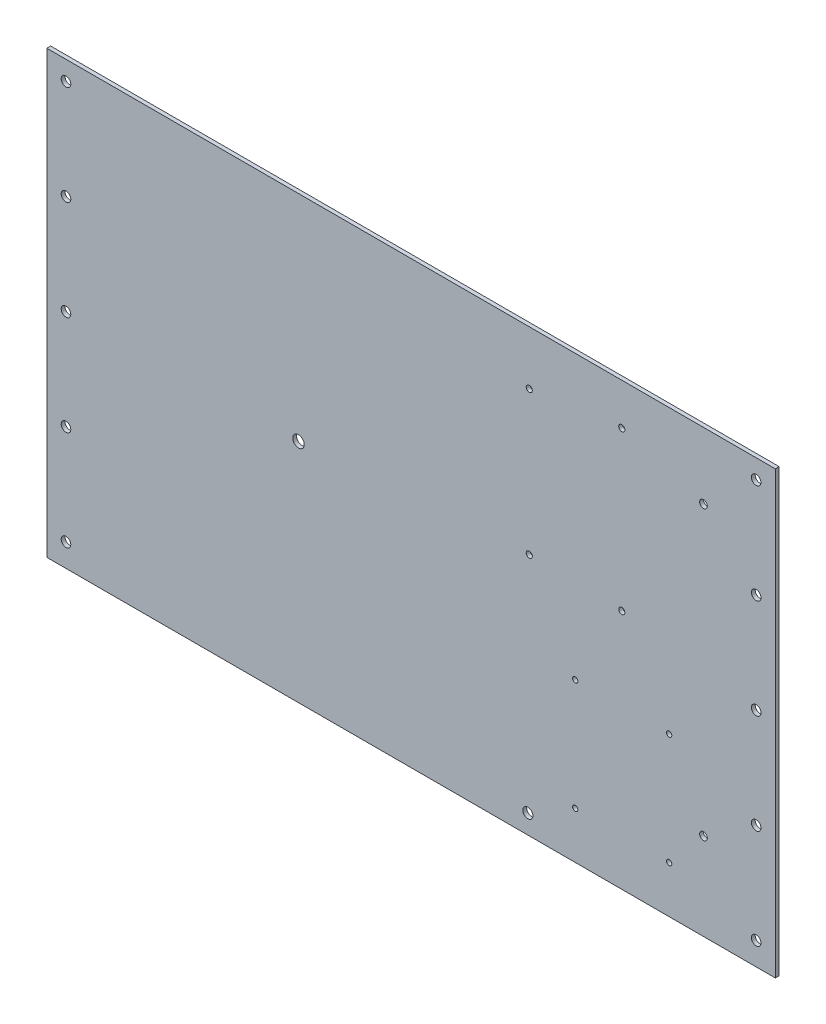
ISO-10303-21;
HEADER;
FILE_DESCRIPTION(('STEP AP214'),'2;1');
FILE_NAME('part.step','',(''),(''),'','','');
FILE_SCHEMA(('AUTOMOTIVE_DESIGN { 1 0 10303 214 1 1 1 1 }'));
ENDSEC;
DATA;
#1=APPLICATION_CONTEXT('core data for automotive mechanical design processes');
#2=APPLICATION_PROTOCOL_DEFINITION('international standard','automotive_design',2000,#1);
#3=PRODUCT_CONTEXT('',#1,'mechanical');
#4=PRODUCT('Part','Part','',(#3));
#5=PRODUCT_RELATED_PRODUCT_CATEGORY('part','',(#4));
#6=PRODUCT_DEFINITION_FORMATION('','',#4);
#7=PRODUCT_DEFINITION_CONTEXT('part definition',#1,'design');
#8=PRODUCT_DEFINITION('design','',#6,#7);
#9=PRODUCT_DEFINITION_SHAPE('','',#8);
#10=(LENGTH_UNIT() NAMED_UNIT(*) SI_UNIT(.MILLI.,.METRE.));
#11=(NAMED_UNIT(*) PLANE_ANGLE_UNIT() SI_UNIT($,.RADIAN.));
#12=(NAMED_UNIT(*) SI_UNIT($,.STERADIAN.) SOLID_ANGLE_UNIT());
#13=UNCERTAINTY_MEASURE_WITH_UNIT(LENGTH_MEASURE(1.E-05),#10,'distance_accuracy_value','');
#14=(GEOMETRIC_REPRESENTATION_CONTEXT(3) GLOBAL_UNCERTAINTY_ASSIGNED_CONTEXT((#13)) GLOBAL_UNIT_ASSIGNED_CONTEXT((#10,
#11,#12)) REPRESENTATION_CONTEXT('',''));
#15=CARTESIAN_POINT('',(0.,0.,0.));
#16=DIRECTION('',(0.,0.,1.));
#17=DIRECTION('',(1.,0.,0.));
#18=AXIS2_PLACEMENT_3D('',#15,#16,#17);
#19=CARTESIAN_POINT('',(-4.52428779759877,-79.9999999999998,2.));
#20=DIRECTION('',(-1.,0.,0.));
#21=DIRECTION('',(0.,-1.,0.));
#22=AXIS2_PLACEMENT_3D('',#19,#20,#21);
#23=PLANE('',#22);
#24=DIRECTION('',(0.,1.,0.));
#25=VECTOR('',#24,1.);
#26=CARTESIAN_POINT('',(-4.52428779759877,-79.9999999999998,0.));
#27=LINE('',#26,#25);
#28=CARTESIAN_POINT('',(-4.52428779759875,-310.,0.));
#29=VERTEX_POINT('',#28);
#30=CARTESIAN_POINT('',(-4.52428779759877,-79.9999999999998,0.));
#31=VERTEX_POINT('',#30);
#32=EDGE_CURVE('E96',#29,#31,#27,.T.);
#33=ORIENTED_EDGE('',*,*,#32,.T.);
#34=DIRECTION('',(0.,0.,-1.));
#35=VECTOR('',#34,1.);
#36=CARTESIAN_POINT('',(-4.52428779759877,-79.9999999999998,2.));
#37=LINE('',#36,#35);
#38=CARTESIAN_POINT('',(-4.52428779759877,-79.9999999999998,2.));
#39=VERTEX_POINT('',#38);
#40=EDGE_CURVE('E11',#39,#31,#37,.T.);
#41=ORIENTED_EDGE('',*,*,#40,.F.);
#42=DIRECTION('',(0.,1.,0.));
#43=VECTOR('',#42,1.);
#44=CARTESIAN_POINT('',(-4.52428779759877,-79.9999999999998,2.));
#45=LINE('',#44,#43);
#46=CARTESIAN_POINT('',(-4.52428779759875,-310.,2.));
#47=VERTEX_POINT('',#46);
#48=EDGE_CURVE('E84',#47,#39,#45,.T.);
#49=ORIENTED_EDGE('',*,*,#48,.F.);
#50=DIRECTION('',(0.,0.,-1.));
#51=VECTOR('',#50,1.);
#52=CARTESIAN_POINT('',(-4.52428779759875,-310.,2.));
#53=LINE('',#52,#51);
#54=EDGE_CURVE('E92',#47,#29,#53,.T.);
#55=ORIENTED_EDGE('',*,*,#54,.T.);
#56=EDGE_LOOP('',(#33,#41,#49,#55));
#57=FACE_BOUND('',#56,.T.);
#58=ADVANCED_FACE('F33',(#57),#23,.F.);
#59=CARTESIAN_POINT('',(-4.52428779759877,-79.9999999999998,2.));
#60=DIRECTION('',(0.,-1.,0.));
#61=DIRECTION('',(1.,0.,0.));
#62=AXIS2_PLACEMENT_3D('',#59,#60,#61);
#63=PLANE('',#62);
#64=DIRECTION('',(-1.,0.,0.));
#65=VECTOR('',#64,1.);
#66=CARTESIAN_POINT('',(-4.52428779759877,-79.9999999999998,0.));
#67=LINE('',#66,#65);
#68=CARTESIAN_POINT('',(-384.524287797599,-79.9999999999999,0.));
#69=VERTEX_POINT('',#68);
#70=EDGE_CURVE('E88',#31,#69,#67,.T.);
#71=ORIENTED_EDGE('',*,*,#70,.T.);
#72=DIRECTION('',(0.,0.,-1.));
#73=VECTOR('',#72,1.);
#74=CARTESIAN_POINT('',(-384.524287797599,-79.9999999999999,2.));
#75=LINE('',#74,#73);
#76=CARTESIAN_POINT('',(-384.524287797599,-79.9999999999999,2.));
#77=VERTEX_POINT('',#76);
#78=EDGE_CURVE('E41',#77,#69,#75,.T.);
#79=ORIENTED_EDGE('',*,*,#78,.F.);
#80=DIRECTION('',(-1.,0.,0.));
#81=VECTOR('',#80,1.);
#82=CARTESIAN_POINT('',(-4.52428779759877,-79.9999999999998,2.));
#83=LINE('',#82,#81);
#84=EDGE_CURVE('E79',#39,#77,#83,.T.);
#85=ORIENTED_EDGE('',*,*,#84,.F.);
#86=ORIENTED_EDGE('',*,*,#40,.T.);
#87=EDGE_LOOP('',(#71,#79,#85,#86));
#88=FACE_BOUND('',#87,.T.);
#89=ADVANCED_FACE('F87',(#88),#63,.F.);
#90=CARTESIAN_POINT('',(-384.524287797599,-79.9999999999999,2.));
#91=DIRECTION('',(1.,0.,0.));
#92=DIRECTION('',(0.,0.,-1.));
#93=AXIS2_PLACEMENT_3D('',#90,#91,#92);
#94=PLANE('',#93);
#95=DIRECTION('',(0.,-1.,0.));
#96=VECTOR('',#95,1.);
#97=CARTESIAN_POINT('',(-384.524287797599,-79.9999999999999,0.));
#98=LINE('',#97,#96);
#99=CARTESIAN_POINT('',(-384.524287797599,-310.,0.));
#100=VERTEX_POINT('',#99);
#101=EDGE_CURVE('E66',#69,#100,#98,.T.);
#102=ORIENTED_EDGE('',*,*,#101,.T.);
#103=DIRECTION('',(0.,0.,-1.));
#104=VECTOR('',#103,1.);
#105=CARTESIAN_POINT('',(-384.524287797599,-310.,2.));
#106=LINE('',#105,#104);
#107=CARTESIAN_POINT('',(-384.524287797599,-310.,2.));
#108=VERTEX_POINT('',#107);
#109=EDGE_CURVE('E89',#108,#100,#106,.T.);
#110=ORIENTED_EDGE('',*,*,#109,.F.);
#111=DIRECTION('',(0.,-1.,0.));
#112=VECTOR('',#111,1.);
#113=CARTESIAN_POINT('',(-384.524287797599,-79.9999999999999,2.));
#114=LINE('',#113,#112);
#115=EDGE_CURVE('E82',#77,#108,#114,.T.);
#116=ORIENTED_EDGE('',*,*,#115,.F.);
#117=ORIENTED_EDGE('',*,*,#78,.T.);
#118=EDGE_LOOP('',(#102,#110,#116,#117));
#119=FACE_BOUND('',#118,.T.);
#120=ADVANCED_FACE('F90',(#119),#94,.F.);
#121=CARTESIAN_POINT('',(-4.52428779759875,-310.,2.));
#122=DIRECTION('',(0.,1.,0.));
#123=DIRECTION('',(-1.,0.,0.));
#124=AXIS2_PLACEMENT_3D('',#121,#122,#123);
#125=PLANE('',#124);
#126=DIRECTION('',(1.,0.,0.));
#127=VECTOR('',#126,1.);
#128=CARTESIAN_POINT('',(-4.52428779759875,-310.,0.));
#129=LINE('',#128,#127);
#130=EDGE_CURVE('E72',#100,#29,#129,.T.);
#131=ORIENTED_EDGE('',*,*,#130,.T.);
#132=ORIENTED_EDGE('',*,*,#54,.F.);
#133=DIRECTION('',(1.,0.,0.));
#134=VECTOR('',#133,1.);
#135=CARTESIAN_POINT('',(-4.52428779759875,-310.,2.));
#136=LINE('',#135,#134);
#137=EDGE_CURVE('E49',#108,#47,#136,.T.);
#138=ORIENTED_EDGE('',*,*,#137,.F.);
#139=ORIENTED_EDGE('',*,*,#109,.T.);
#140=EDGE_LOOP('',(#131,#132,#138,#139));
#141=FACE_BOUND('',#140,.T.);
#142=ADVANCED_FACE('F104',(#141),#125,.F.);
#143=CARTESIAN_POINT('',(0.,0.,2.));
#144=DIRECTION('',(0.,0.,-1.));
#145=DIRECTION('',(-1.,0.,0.));
#146=AXIS2_PLACEMENT_3D('',#143,#144,#145);
#147=PLANE('',#146);
#148=CARTESIAN_POINT('',(-133.614229540646,-300.,2.));
#149=DIRECTION('',(0.,0.,1.));
#150=DIRECTION('',(1.,0.,0.));
#151=AXIS2_PLACEMENT_3D('',#148,#149,#150);
#152=CIRCLE('',#151,2.59999999999999);
#153=CARTESIAN_POINT('',(-131.014229540646,-300.,2.));
#154=VERTEX_POINT('',#153);
#155=EDGE_CURVE('E236',#154,#154,#152,.T.);
#156=ORIENTED_EDGE('',*,*,#155,.F.);
#157=EDGE_LOOP('',(#156));
#158=FACE_BOUND('',#157,.T.);
#159=CARTESIAN_POINT('',(-84.6190740075595,-101.667480714402,2.));
#160=DIRECTION('',(0.,0.,1.));
#161=DIRECTION('',(1.,0.,0.));
#162=AXIS2_PLACEMENT_3D('',#159,#160,#161);
#163=CIRCLE('',#162,1.60476866508562);
#164=CARTESIAN_POINT('',(-83.0143053424738,-101.667480714402,2.));
#165=VERTEX_POINT('',#164);
#166=EDGE_CURVE('E195',#165,#165,#163,.T.);
#167=ORIENTED_EDGE('',*,*,#166,.F.);
#168=EDGE_LOOP('',(#167));
#169=FACE_BOUND('',#168,.T.);
#170=CARTESIAN_POINT('',(-253.250828503278,-191.950902838941,2.));
#171=DIRECTION('',(0.,0.,1.));
#172=DIRECTION('',(1.,0.,0.));
#173=AXIS2_PLACEMENT_3D('',#170,#171,#172);
#174=CIRCLE('',#173,2.99999999999999);
#175=CARTESIAN_POINT('',(-250.250828503278,-191.950902838941,2.));
#176=VERTEX_POINT('',#175);
#177=EDGE_CURVE('E220',#176,#176,#174,.T.);
#178=ORIENTED_EDGE('',*,*,#177,.F.);
#179=EDGE_LOOP('',(#178));
#180=FACE_BOUND('',#179,.T.);
#181=CARTESIAN_POINT('',(-42.0242877975989,-114.637326757356,2.));
#182=DIRECTION('',(0.,0.,1.));
#183=DIRECTION('',(1.,0.,0.));
#184=AXIS2_PLACEMENT_3D('',#181,#182,#183);
#185=CIRCLE('',#184,1.99507445987253);
#186=CARTESIAN_POINT('',(-40.0292133377264,-114.637326757356,2.));
#187=VERTEX_POINT('',#186);
#188=EDGE_CURVE('E227',#187,#187,#185,.T.);
#189=ORIENTED_EDGE('',*,*,#188,.F.);
#190=EDGE_LOOP('',(#189));
#191=FACE_BOUND('',#190,.T.);
#192=CARTESIAN_POINT('',(-132.879074007559,-108.017480714402,2.));
#193=DIRECTION('',(0.,0.,1.));
#194=DIRECTION('',(1.,0.,0.));
#195=AXIS2_PLACEMENT_3D('',#192,#193,#194);
#196=CIRCLE('',#195,1.58968929716832);
#197=CARTESIAN_POINT('',(-131.289384710391,-108.017480714402,2.));
#198=VERTEX_POINT('',#197);
#199=EDGE_CURVE('E189',#198,#198,#196,.T.);
#200=ORIENTED_EDGE('',*,*,#199,.F.);
#201=EDGE_LOOP('',(#200));
#202=FACE_BOUND('',#201,.T.);
#203=CARTESIAN_POINT('',(-132.879074007559,-182.947480714402,2.));
#204=DIRECTION('',(0.,0.,1.));
#205=DIRECTION('',(1.,0.,0.));
#206=AXIS2_PLACEMENT_3D('',#203,#204,#205);
#207=CIRCLE('',#206,1.58749999999992);
#208=CARTESIAN_POINT('',(-131.291574007559,-182.947480714402,2.));
#209=VERTEX_POINT('',#208);
#210=EDGE_CURVE('E183',#209,#209,#207,.T.);
#211=ORIENTED_EDGE('',*,*,#210,.F.);
#212=EDGE_LOOP('',(#211));
#213=FACE_BOUND('',#212,.T.);
#214=CARTESIAN_POINT('',(-84.6190740075595,-184.217480714402,2.));
#215=DIRECTION('',(0.,0.,1.));
#216=DIRECTION('',(1.,0.,0.));
#217=AXIS2_PLACEMENT_3D('',#214,#215,#216);
#218=CIRCLE('',#217,1.58749999999996);
#219=CARTESIAN_POINT('',(-83.0315740075595,-184.217480714402,2.));
#220=VERTEX_POINT('',#219);
#221=EDGE_CURVE('E177',#220,#220,#218,.T.);
#222=ORIENTED_EDGE('',*,*,#221,.F.);
#223=EDGE_LOOP('',(#222));
#224=FACE_BOUND('',#223,.T.);
#225=CARTESIAN_POINT('',(-108.908932218328,-227.518390056277,2.));
#226=DIRECTION('',(0.,0.,1.));
#227=DIRECTION('',(1.,0.,0.));
#228=AXIS2_PLACEMENT_3D('',#225,#226,#227);
#229=CIRCLE('',#228,1.37500000000002);
#230=CARTESIAN_POINT('',(-107.533932218328,-227.518390056277,2.));
#231=VERTEX_POINT('',#230);
#232=EDGE_CURVE('E170',#231,#231,#229,.T.);
#233=ORIENTED_EDGE('',*,*,#232,.F.);
#234=EDGE_LOOP('',(#233));
#235=FACE_BOUND('',#234,.T.);
#236=CARTESIAN_POINT('',(-42.0242877975989,-264.637326757356,2.));
#237=DIRECTION('',(0.,0.,1.));
#238=DIRECTION('',(1.,0.,0.));
#239=AXIS2_PLACEMENT_3D('',#236,#237,#238);
#240=CIRCLE('',#239,2.00000000000002);
#241=CARTESIAN_POINT('',(-40.0242877975989,-264.637326757356,2.));
#242=VERTEX_POINT('',#241);
#243=EDGE_CURVE('E208',#242,#242,#240,.T.);
#244=ORIENTED_EDGE('',*,*,#243,.F.);
#245=EDGE_LOOP('',(#244));
#246=FACE_BOUND('',#245,.T.);
#247=CARTESIAN_POINT('',(-108.908932218328,-285.518390056277,2.));
#248=DIRECTION('',(0.,0.,1.));
#249=DIRECTION('',(1.,0.,0.));
#250=AXIS2_PLACEMENT_3D('',#247,#248,#249);
#251=CIRCLE('',#250,1.36223874659975);
#252=CARTESIAN_POINT('',(-107.546693471728,-285.518390056277,2.));
#253=VERTEX_POINT('',#252);
#254=EDGE_CURVE('E215',#253,#253,#251,.T.);
#255=ORIENTED_EDGE('',*,*,#254,.F.);
#256=EDGE_LOOP('',(#255));
#257=FACE_BOUND('',#256,.T.);
#258=CARTESIAN_POINT('',(-59.9089322183282,-285.518390056277,2.));
#259=DIRECTION('',(0.,0.,1.));
#260=DIRECTION('',(1.,0.,0.));
#261=AXIS2_PLACEMENT_3D('',#258,#259,#260);
#262=CIRCLE('',#261,1.37250157420993);
#263=CARTESIAN_POINT('',(-58.5364306441182,-285.518390056277,2.));
#264=VERTEX_POINT('',#263);
#265=EDGE_CURVE('E196',#264,#264,#262,.T.);
#266=ORIENTED_EDGE('',*,*,#265,.F.);
#267=EDGE_LOOP('',(#266));
#268=FACE_BOUND('',#267,.T.);
#269=CARTESIAN_POINT('',(-59.9089322183282,-227.518390056277,2.));
#270=DIRECTION('',(0.,0.,1.));
#271=DIRECTION('',(1.,0.,0.));
#272=AXIS2_PLACEMENT_3D('',#269,#270,#271);
#273=CIRCLE('',#272,1.37500000000001);
#274=CARTESIAN_POINT('',(-58.5339322183282,-227.518390056277,2.));
#275=VERTEX_POINT('',#274);
#276=EDGE_CURVE('E203',#275,#275,#273,.T.);
#277=ORIENTED_EDGE('',*,*,#276,.F.);
#278=EDGE_LOOP('',(#277));
#279=FACE_BOUND('',#278,.T.);
#280=CARTESIAN_POINT('',(-14.524287797599,-89.9999999999998,2.));
#281=DIRECTION('',(0.,0.,1.));
#282=DIRECTION('',(1.,0.,0.));
#283=AXIS2_PLACEMENT_3D('',#280,#281,#282);
#284=CIRCLE('',#283,2.50000000000002);
#285=CARTESIAN_POINT('',(-12.024287797599,-89.9999999999998,2.));
#286=VERTEX_POINT('',#285);
#287=EDGE_CURVE('E119',#286,#286,#284,.T.);
#288=ORIENTED_EDGE('',*,*,#287,.F.);
#289=EDGE_LOOP('',(#288));
#290=FACE_BOUND('',#289,.T.);
#291=CARTESIAN_POINT('',(-14.5242877975985,-142.,2.));
#292=DIRECTION('',(0.,0.,1.));
#293=DIRECTION('',(1.,0.,0.));
#294=AXIS2_PLACEMENT_3D('',#291,#292,#293);
#295=CIRCLE('',#294,2.50000000000002);
#296=CARTESIAN_POINT('',(-12.0242877975984,-142.,2.));
#297=VERTEX_POINT('',#296);
#298=EDGE_CURVE('E126',#297,#297,#295,.T.);
#299=ORIENTED_EDGE('',*,*,#298,.F.);
#300=EDGE_LOOP('',(#299));
#301=FACE_BOUND('',#300,.T.);
#302=CARTESIAN_POINT('',(-14.5242877975979,-194.,2.));
#303=DIRECTION('',(0.,0.,1.));
#304=DIRECTION('',(1.,0.,0.));
#305=AXIS2_PLACEMENT_3D('',#302,#303,#304);
#306=CIRCLE('',#305,2.50000000000002);
#307=CARTESIAN_POINT('',(-12.0242877975979,-194.,2.));
#308=VERTEX_POINT('',#307);
#309=EDGE_CURVE('E132',#308,#308,#306,.T.);
#310=ORIENTED_EDGE('',*,*,#309,.F.);
#311=EDGE_LOOP('',(#310));
#312=FACE_BOUND('',#311,.T.);
#313=CARTESIAN_POINT('',(-14.5242877975968,-298.,2.));
#314=DIRECTION('',(0.,0.,1.));
#315=DIRECTION('',(1.,0.,0.));
#316=AXIS2_PLACEMENT_3D('',#313,#314,#315);
#317=CIRCLE('',#316,2.50000000000002);
#318=CARTESIAN_POINT('',(-12.0242877975968,-298.,2.));
#319=VERTEX_POINT('',#318);
#320=EDGE_CURVE('E138',#319,#319,#317,.T.);
#321=ORIENTED_EDGE('',*,*,#320,.F.);
#322=EDGE_LOOP('',(#321));
#323=FACE_BOUND('',#322,.T.);
#324=CARTESIAN_POINT('',(-14.5242877975974,-246.,2.));
#325=DIRECTION('',(0.,0.,1.));
#326=DIRECTION('',(1.,0.,0.));
#327=AXIS2_PLACEMENT_3D('',#324,#325,#326);
#328=CIRCLE('',#327,2.50000000000002);
#329=CARTESIAN_POINT('',(-12.0242877975974,-246.,2.));
#330=VERTEX_POINT('',#329);
#331=EDGE_CURVE('E144',#330,#330,#328,.T.);
#332=ORIENTED_EDGE('',*,*,#331,.F.);
#333=EDGE_LOOP('',(#332));
#334=FACE_BOUND('',#333,.T.);
#335=CARTESIAN_POINT('',(-374.524287797597,-298.,2.));
#336=DIRECTION('',(0.,0.,1.));
#337=DIRECTION('',(1.,0.,0.));
#338=AXIS2_PLACEMENT_3D('',#335,#336,#337);
#339=CIRCLE('',#338,2.50000000000002);
#340=CARTESIAN_POINT('',(-372.024287797597,-298.,2.));
#341=VERTEX_POINT('',#340);
#342=EDGE_CURVE('E150',#341,#341,#339,.T.);
#343=ORIENTED_EDGE('',*,*,#342,.F.);
#344=EDGE_LOOP('',(#343));
#345=FACE_BOUND('',#344,.T.);
#346=CARTESIAN_POINT('',(-374.524287797597,-246.,2.));
#347=DIRECTION('',(0.,0.,1.));
#348=DIRECTION('',(1.,0.,0.));
#349=AXIS2_PLACEMENT_3D('',#346,#347,#348);
#350=CIRCLE('',#349,2.50000000000002);
#351=CARTESIAN_POINT('',(-372.024287797597,-246.,2.));
#352=VERTEX_POINT('',#351);
#353=EDGE_CURVE('E156',#352,#352,#350,.T.);
#354=ORIENTED_EDGE('',*,*,#353,.F.);
#355=EDGE_LOOP('',(#354));
#356=FACE_BOUND('',#355,.T.);
#357=CARTESIAN_POINT('',(-374.524287797598,-194.,2.));
#358=DIRECTION('',(0.,0.,1.));
#359=DIRECTION('',(1.,0.,0.));
#360=AXIS2_PLACEMENT_3D('',#357,#358,#359);
#361=CIRCLE('',#360,2.50000000000002);
#362=CARTESIAN_POINT('',(-372.024287797598,-194.,2.));
#363=VERTEX_POINT('',#362);
#364=EDGE_CURVE('E162',#363,#363,#361,.T.);
#365=ORIENTED_EDGE('',*,*,#364,.F.);
#366=EDGE_LOOP('',(#365));
#367=FACE_BOUND('',#366,.T.);
#368=CARTESIAN_POINT('',(-374.524287797598,-142.,2.));
#369=DIRECTION('',(0.,0.,1.));
#370=DIRECTION('',(1.,0.,0.));
#371=AXIS2_PLACEMENT_3D('',#368,#369,#370);
#372=CIRCLE('',#371,2.50000000000002);
#373=CARTESIAN_POINT('',(-372.024287797598,-142.,2.));
#374=VERTEX_POINT('',#373);
#375=EDGE_CURVE('E113',#374,#374,#372,.T.);
#376=ORIENTED_EDGE('',*,*,#375,.F.);
#377=EDGE_LOOP('',(#376));
#378=FACE_BOUND('',#377,.T.);
#379=CARTESIAN_POINT('',(-374.524287797599,-89.9999999999998,2.));
#380=DIRECTION('',(0.,0.,1.));
#381=DIRECTION('',(1.,0.,0.));
#382=AXIS2_PLACEMENT_3D('',#379,#380,#381);
#383=CIRCLE('',#382,2.50000000000002);
#384=CARTESIAN_POINT('',(-372.024287797599,-89.9999999999998,2.));
#385=VERTEX_POINT('',#384);
#386=EDGE_CURVE('E110',#385,#385,#383,.T.);
#387=ORIENTED_EDGE('',*,*,#386,.F.);
#388=EDGE_LOOP('',(#387));
#389=FACE_BOUND('',#388,.T.);
#390=ORIENTED_EDGE('',*,*,#48,.T.);
#391=ORIENTED_EDGE('',*,*,#84,.T.);
#392=ORIENTED_EDGE('',*,*,#115,.T.);
#393=ORIENTED_EDGE('',*,*,#137,.T.);
#394=EDGE_LOOP('',(#390,#391,#392,#393));
#395=FACE_BOUND('',#394,.T.);
#396=ADVANCED_FACE('F80',(#158,#169,#180,#191,#202,#213,#224,#235,#246,#257,#268,#279,#290,#301,
#312,#323,#334,#345,#356,#367,#378,#389,#395),#147,.F.);
#397=CARTESIAN_POINT('',(0.,0.,0.));
#398=DIRECTION('',(0.,0.,-1.));
#399=DIRECTION('',(-1.,0.,0.));
#400=AXIS2_PLACEMENT_3D('',#397,#398,#399);
#401=PLANE('',#400);
#402=CARTESIAN_POINT('',(-133.614229540646,-300.,0.));
#403=DIRECTION('',(0.,0.,1.));
#404=DIRECTION('',(1.,0.,0.));
#405=AXIS2_PLACEMENT_3D('',#402,#403,#404);
#406=CIRCLE('',#405,2.59999999999999);
#407=CARTESIAN_POINT('',(-131.014229540646,-300.,0.));
#408=VERTEX_POINT('',#407);
#409=EDGE_CURVE('E224',#408,#408,#406,.T.);
#410=ORIENTED_EDGE('',*,*,#409,.T.);
#411=EDGE_LOOP('',(#410));
#412=FACE_BOUND('',#411,.T.);
#413=CARTESIAN_POINT('',(-84.6190740075595,-101.667480714402,0.));
#414=DIRECTION('',(0.,0.,1.));
#415=DIRECTION('',(1.,0.,0.));
#416=AXIS2_PLACEMENT_3D('',#413,#414,#415);
#417=CIRCLE('',#416,1.60476866508562);
#418=CARTESIAN_POINT('',(-83.0143053424738,-101.667480714402,0.));
#419=VERTEX_POINT('',#418);
#420=EDGE_CURVE('E120',#419,#419,#417,.T.);
#421=ORIENTED_EDGE('',*,*,#420,.T.);
#422=EDGE_LOOP('',(#421));
#423=FACE_BOUND('',#422,.T.);
#424=CARTESIAN_POINT('',(-253.250828503278,-191.950902838941,0.));
#425=DIRECTION('',(0.,0.,1.));
#426=DIRECTION('',(1.,0.,0.));
#427=AXIS2_PLACEMENT_3D('',#424,#425,#426);
#428=CIRCLE('',#427,2.99999999999999);
#429=CARTESIAN_POINT('',(-250.250828503278,-191.950902838941,0.));
#430=VERTEX_POINT('',#429);
#431=EDGE_CURVE('E223',#430,#430,#428,.T.);
#432=ORIENTED_EDGE('',*,*,#431,.T.);
#433=EDGE_LOOP('',(#432));
#434=FACE_BOUND('',#433,.T.);
#435=CARTESIAN_POINT('',(-42.0242877975989,-114.637326757356,0.));
#436=DIRECTION('',(0.,0.,1.));
#437=DIRECTION('',(1.,0.,0.));
#438=AXIS2_PLACEMENT_3D('',#435,#436,#437);
#439=CIRCLE('',#438,1.99507445987253);
#440=CARTESIAN_POINT('',(-40.0292133377264,-114.637326757356,0.));
#441=VERTEX_POINT('',#440);
#442=EDGE_CURVE('E212',#441,#441,#439,.T.);
#443=ORIENTED_EDGE('',*,*,#442,.T.);
#444=EDGE_LOOP('',(#443));
#445=FACE_BOUND('',#444,.T.);
#446=CARTESIAN_POINT('',(-132.879074007559,-108.017480714402,0.));
#447=DIRECTION('',(0.,0.,1.));
#448=DIRECTION('',(1.,0.,0.));
#449=AXIS2_PLACEMENT_3D('',#446,#447,#448);
#450=CIRCLE('',#449,1.58968929716832);
#451=CARTESIAN_POINT('',(-131.289384710391,-108.017480714402,0.));
#452=VERTEX_POINT('',#451);
#453=EDGE_CURVE('E192',#452,#452,#450,.T.);
#454=ORIENTED_EDGE('',*,*,#453,.T.);
#455=EDGE_LOOP('',(#454));
#456=FACE_BOUND('',#455,.T.);
#457=CARTESIAN_POINT('',(-132.879074007559,-182.947480714402,0.));
#458=DIRECTION('',(0.,0.,1.));
#459=DIRECTION('',(1.,0.,0.));
#460=AXIS2_PLACEMENT_3D('',#457,#458,#459);
#461=CIRCLE('',#460,1.58749999999992);
#462=CARTESIAN_POINT('',(-131.291574007559,-182.947480714402,0.));
#463=VERTEX_POINT('',#462);
#464=EDGE_CURVE('E186',#463,#463,#461,.T.);
#465=ORIENTED_EDGE('',*,*,#464,.T.);
#466=EDGE_LOOP('',(#465));
#467=FACE_BOUND('',#466,.T.);
#468=CARTESIAN_POINT('',(-84.6190740075595,-184.217480714402,0.));
#469=DIRECTION('',(0.,0.,1.));
#470=DIRECTION('',(1.,0.,0.));
#471=AXIS2_PLACEMENT_3D('',#468,#469,#470);
#472=CIRCLE('',#471,1.58749999999996);
#473=CARTESIAN_POINT('',(-83.0315740075595,-184.217480714402,0.));
#474=VERTEX_POINT('',#473);
#475=EDGE_CURVE('E180',#474,#474,#472,.T.);
#476=ORIENTED_EDGE('',*,*,#475,.T.);
#477=EDGE_LOOP('',(#476));
#478=FACE_BOUND('',#477,.T.);
#479=CARTESIAN_POINT('',(-108.908932218328,-227.518390056277,0.));
#480=DIRECTION('',(0.,0.,1.));
#481=DIRECTION('',(1.,0.,0.));
#482=AXIS2_PLACEMENT_3D('',#479,#480,#481);
#483=CIRCLE('',#482,1.37500000000002);
#484=CARTESIAN_POINT('',(-107.533932218328,-227.518390056277,0.));
#485=VERTEX_POINT('',#484);
#486=EDGE_CURVE('E173',#485,#485,#483,.T.);
#487=ORIENTED_EDGE('',*,*,#486,.T.);
#488=EDGE_LOOP('',(#487));
#489=FACE_BOUND('',#488,.T.);
#490=CARTESIAN_POINT('',(-42.0242877975989,-264.637326757356,0.));
#491=DIRECTION('',(0.,0.,1.));
#492=DIRECTION('',(1.,0.,0.));
#493=AXIS2_PLACEMENT_3D('',#490,#491,#492);
#494=CIRCLE('',#493,2.00000000000002);
#495=CARTESIAN_POINT('',(-40.0242877975989,-264.637326757356,0.));
#496=VERTEX_POINT('',#495);
#497=EDGE_CURVE('E211',#496,#496,#494,.T.);
#498=ORIENTED_EDGE('',*,*,#497,.T.);
#499=EDGE_LOOP('',(#498));
#500=FACE_BOUND('',#499,.T.);
#501=CARTESIAN_POINT('',(-108.908932218328,-285.518390056277,0.));
#502=DIRECTION('',(0.,0.,1.));
#503=DIRECTION('',(1.,0.,0.));
#504=AXIS2_PLACEMENT_3D('',#501,#502,#503);
#505=CIRCLE('',#504,1.36223874659975);
#506=CARTESIAN_POINT('',(-107.546693471728,-285.518390056277,0.));
#507=VERTEX_POINT('',#506);
#508=EDGE_CURVE('E200',#507,#507,#505,.T.);
#509=ORIENTED_EDGE('',*,*,#508,.T.);
#510=EDGE_LOOP('',(#509));
#511=FACE_BOUND('',#510,.T.);
#512=CARTESIAN_POINT('',(-59.9089322183282,-285.518390056277,0.));
#513=DIRECTION('',(0.,0.,1.));
#514=DIRECTION('',(1.,0.,0.));
#515=AXIS2_PLACEMENT_3D('',#512,#513,#514);
#516=CIRCLE('',#515,1.37250157420993);
#517=CARTESIAN_POINT('',(-58.5364306441182,-285.518390056277,0.));
#518=VERTEX_POINT('',#517);
#519=EDGE_CURVE('E199',#518,#518,#516,.T.);
#520=ORIENTED_EDGE('',*,*,#519,.T.);
#521=EDGE_LOOP('',(#520));
#522=FACE_BOUND('',#521,.T.);
#523=CARTESIAN_POINT('',(-59.9089322183282,-227.518390056277,0.));
#524=DIRECTION('',(0.,0.,1.));
#525=DIRECTION('',(1.,0.,0.));
#526=AXIS2_PLACEMENT_3D('',#523,#524,#525);
#527=CIRCLE('',#526,1.37500000000001);
#528=CARTESIAN_POINT('',(-58.5339322183282,-227.518390056277,0.));
#529=VERTEX_POINT('',#528);
#530=EDGE_CURVE('E174',#529,#529,#527,.T.);
#531=ORIENTED_EDGE('',*,*,#530,.T.);
#532=EDGE_LOOP('',(#531));
#533=FACE_BOUND('',#532,.T.);
#534=CARTESIAN_POINT('',(-14.524287797599,-89.9999999999998,0.));
#535=DIRECTION('',(0.,0.,1.));
#536=DIRECTION('',(1.,0.,0.));
#537=AXIS2_PLACEMENT_3D('',#534,#535,#536);
#538=CIRCLE('',#537,2.50000000000002);
#539=CARTESIAN_POINT('',(-12.024287797599,-89.9999999999998,0.));
#540=VERTEX_POINT('',#539);
#541=EDGE_CURVE('E116',#540,#540,#538,.T.);
#542=ORIENTED_EDGE('',*,*,#541,.T.);
#543=EDGE_LOOP('',(#542));
#544=FACE_BOUND('',#543,.T.);
#545=CARTESIAN_POINT('',(-14.5242877975985,-142.,0.));
#546=DIRECTION('',(0.,0.,1.));
#547=DIRECTION('',(1.,0.,0.));
#548=AXIS2_PLACEMENT_3D('',#545,#546,#547);
#549=CIRCLE('',#548,2.50000000000002);
#550=CARTESIAN_POINT('',(-12.0242877975984,-142.,0.));
#551=VERTEX_POINT('',#550);
#552=EDGE_CURVE('E123',#551,#551,#549,.T.);
#553=ORIENTED_EDGE('',*,*,#552,.T.);
#554=EDGE_LOOP('',(#553));
#555=FACE_BOUND('',#554,.T.);
#556=CARTESIAN_POINT('',(-14.5242877975979,-194.,0.));
#557=DIRECTION('',(0.,0.,1.));
#558=DIRECTION('',(1.,0.,0.));
#559=AXIS2_PLACEMENT_3D('',#556,#557,#558);
#560=CIRCLE('',#559,2.50000000000002);
#561=CARTESIAN_POINT('',(-12.0242877975979,-194.,0.));
#562=VERTEX_POINT('',#561);
#563=EDGE_CURVE('E129',#562,#562,#560,.T.);
#564=ORIENTED_EDGE('',*,*,#563,.T.);
#565=EDGE_LOOP('',(#564));
#566=FACE_BOUND('',#565,.T.);
#567=CARTESIAN_POINT('',(-14.5242877975968,-298.,0.));
#568=DIRECTION('',(0.,0.,1.));
#569=DIRECTION('',(1.,0.,0.));
#570=AXIS2_PLACEMENT_3D('',#567,#568,#569);
#571=CIRCLE('',#570,2.50000000000002);
#572=CARTESIAN_POINT('',(-12.0242877975968,-298.,0.));
#573=VERTEX_POINT('',#572);
#574=EDGE_CURVE('E135',#573,#573,#571,.T.);
#575=ORIENTED_EDGE('',*,*,#574,.T.);
#576=EDGE_LOOP('',(#575));
#577=FACE_BOUND('',#576,.T.);
#578=CARTESIAN_POINT('',(-14.5242877975974,-246.,0.));
#579=DIRECTION('',(0.,0.,1.));
#580=DIRECTION('',(1.,0.,0.));
#581=AXIS2_PLACEMENT_3D('',#578,#579,#580);
#582=CIRCLE('',#581,2.50000000000002);
#583=CARTESIAN_POINT('',(-12.0242877975974,-246.,0.));
#584=VERTEX_POINT('',#583);
#585=EDGE_CURVE('E141',#584,#584,#582,.T.);
#586=ORIENTED_EDGE('',*,*,#585,.T.);
#587=EDGE_LOOP('',(#586));
#588=FACE_BOUND('',#587,.T.);
#589=CARTESIAN_POINT('',(-374.524287797597,-298.,0.));
#590=DIRECTION('',(0.,0.,1.));
#591=DIRECTION('',(1.,0.,0.));
#592=AXIS2_PLACEMENT_3D('',#589,#590,#591);
#593=CIRCLE('',#592,2.50000000000002);
#594=CARTESIAN_POINT('',(-372.024287797597,-298.,0.));
#595=VERTEX_POINT('',#594);
#596=EDGE_CURVE('E147',#595,#595,#593,.T.);
#597=ORIENTED_EDGE('',*,*,#596,.T.);
#598=EDGE_LOOP('',(#597));
#599=FACE_BOUND('',#598,.T.);
#600=CARTESIAN_POINT('',(-374.524287797597,-246.,0.));
#601=DIRECTION('',(0.,0.,1.));
#602=DIRECTION('',(1.,0.,0.));
#603=AXIS2_PLACEMENT_3D('',#600,#601,#602);
#604=CIRCLE('',#603,2.50000000000002);
#605=CARTESIAN_POINT('',(-372.024287797597,-246.,0.));
#606=VERTEX_POINT('',#605);
#607=EDGE_CURVE('E153',#606,#606,#604,.T.);
#608=ORIENTED_EDGE('',*,*,#607,.T.);
#609=EDGE_LOOP('',(#608));
#610=FACE_BOUND('',#609,.T.);
#611=CARTESIAN_POINT('',(-374.524287797598,-194.,0.));
#612=DIRECTION('',(0.,0.,1.));
#613=DIRECTION('',(1.,0.,0.));
#614=AXIS2_PLACEMENT_3D('',#611,#612,#613);
#615=CIRCLE('',#614,2.50000000000002);
#616=CARTESIAN_POINT('',(-372.024287797598,-194.,0.));
#617=VERTEX_POINT('',#616);
#618=EDGE_CURVE('E159',#617,#617,#615,.T.);
#619=ORIENTED_EDGE('',*,*,#618,.T.);
#620=EDGE_LOOP('',(#619));
#621=FACE_BOUND('',#620,.T.);
#622=CARTESIAN_POINT('',(-374.524287797598,-142.,0.));
#623=DIRECTION('',(0.,0.,1.));
#624=DIRECTION('',(1.,0.,0.));
#625=AXIS2_PLACEMENT_3D('',#622,#623,#624);
#626=CIRCLE('',#625,2.50000000000002);
#627=CARTESIAN_POINT('',(-372.024287797598,-142.,0.));
#628=VERTEX_POINT('',#627);
#629=EDGE_CURVE('E165',#628,#628,#626,.T.);
#630=ORIENTED_EDGE('',*,*,#629,.T.);
#631=EDGE_LOOP('',(#630));
#632=FACE_BOUND('',#631,.T.);
#633=CARTESIAN_POINT('',(-374.524287797599,-89.9999999999998,0.));
#634=DIRECTION('',(0.,0.,1.));
#635=DIRECTION('',(1.,0.,0.));
#636=AXIS2_PLACEMENT_3D('',#633,#634,#635);
#637=CIRCLE('',#636,2.50000000000002);
#638=CARTESIAN_POINT('',(-372.024287797599,-89.9999999999998,0.));
#639=VERTEX_POINT('',#638);
#640=EDGE_CURVE('E99',#639,#639,#637,.T.);
#641=ORIENTED_EDGE('',*,*,#640,.T.);
#642=EDGE_LOOP('',(#641));
#643=FACE_BOUND('',#642,.T.);
#644=ORIENTED_EDGE('',*,*,#32,.F.);
#645=ORIENTED_EDGE('',*,*,#130,.F.);
#646=ORIENTED_EDGE('',*,*,#101,.F.);
#647=ORIENTED_EDGE('',*,*,#70,.F.);
#648=EDGE_LOOP('',(#644,#645,#646,#647));
#649=FACE_BOUND('',#648,.T.);
#650=ADVANCED_FACE('F107',(#412,#423,#434,#445,#456,#467,#478,#489,#500,#511,#522,#533,#544,
#555,#566,#577,#588,#599,#610,#621,#632,#643,#649),#401,.T.);
#651=CARTESIAN_POINT('',(-374.524287797599,-89.9999999999998,0.));
#652=DIRECTION('',(0.,0.,1.));
#653=DIRECTION('',(1.,0.,0.));
#654=AXIS2_PLACEMENT_3D('',#651,#652,#653);
#655=CYLINDRICAL_SURFACE('',#654,2.50000000000002);
#656=ORIENTED_EDGE('',*,*,#640,.F.);
#657=EDGE_LOOP('',(#656));
#658=FACE_BOUND('',#657,.T.);
#659=ORIENTED_EDGE('',*,*,#386,.T.);
#660=EDGE_LOOP('',(#659));
#661=FACE_BOUND('',#660,.T.);
#662=ADVANCED_FACE('F296',(#658,#661),#655,.F.);
#663=CARTESIAN_POINT('',(-374.524287797598,-142.,0.));
#664=DIRECTION('',(0.,0.,1.));
#665=DIRECTION('',(1.,0.,0.));
#666=AXIS2_PLACEMENT_3D('',#663,#664,#665);
#667=CYLINDRICAL_SURFACE('',#666,2.50000000000002);
#668=ORIENTED_EDGE('',*,*,#629,.F.);
#669=EDGE_LOOP('',(#668));
#670=FACE_BOUND('',#669,.T.);
#671=ORIENTED_EDGE('',*,*,#375,.T.);
#672=EDGE_LOOP('',(#671));
#673=FACE_BOUND('',#672,.T.);
#674=ADVANCED_FACE('F298',(#670,#673),#667,.F.);
#675=CARTESIAN_POINT('',(-374.524287797598,-194.,0.));
#676=DIRECTION('',(0.,0.,1.));
#677=DIRECTION('',(1.,0.,0.));
#678=AXIS2_PLACEMENT_3D('',#675,#676,#677);
#679=CYLINDRICAL_SURFACE('',#678,2.50000000000002);
#680=ORIENTED_EDGE('',*,*,#618,.F.);
#681=EDGE_LOOP('',(#680));
#682=FACE_BOUND('',#681,.T.);
#683=ORIENTED_EDGE('',*,*,#364,.T.);
#684=EDGE_LOOP('',(#683));
#685=FACE_BOUND('',#684,.T.);
#686=ADVANCED_FACE('F305',(#682,#685),#679,.F.);
#687=CARTESIAN_POINT('',(-374.524287797597,-246.,0.));
#688=DIRECTION('',(0.,0.,1.));
#689=DIRECTION('',(1.,0.,0.));
#690=AXIS2_PLACEMENT_3D('',#687,#688,#689);
#691=CYLINDRICAL_SURFACE('',#690,2.50000000000002);
#692=ORIENTED_EDGE('',*,*,#607,.F.);
#693=EDGE_LOOP('',(#692));
#694=FACE_BOUND('',#693,.T.);
#695=ORIENTED_EDGE('',*,*,#353,.T.);
#696=EDGE_LOOP('',(#695));
#697=FACE_BOUND('',#696,.T.);
#698=ADVANCED_FACE('F477',(#694,#697),#691,.F.);
#699=CARTESIAN_POINT('',(-374.524287797597,-298.,0.));
#700=DIRECTION('',(0.,0.,1.));
#701=DIRECTION('',(1.,0.,0.));
#702=AXIS2_PLACEMENT_3D('',#699,#700,#701);
#703=CYLINDRICAL_SURFACE('',#702,2.50000000000002);
#704=ORIENTED_EDGE('',*,*,#596,.F.);
#705=EDGE_LOOP('',(#704));
#706=FACE_BOUND('',#705,.T.);
#707=ORIENTED_EDGE('',*,*,#342,.T.);
#708=EDGE_LOOP('',(#707));
#709=FACE_BOUND('',#708,.T.);
#710=ADVANCED_FACE('F469',(#706,#709),#703,.F.);
#711=CARTESIAN_POINT('',(-14.5242877975974,-246.,0.));
#712=DIRECTION('',(0.,0.,1.));
#713=DIRECTION('',(1.,0.,0.));
#714=AXIS2_PLACEMENT_3D('',#711,#712,#713);
#715=CYLINDRICAL_SURFACE('',#714,2.50000000000002);
#716=ORIENTED_EDGE('',*,*,#585,.F.);
#717=EDGE_LOOP('',(#716));
#718=FACE_BOUND('',#717,.T.);
#719=ORIENTED_EDGE('',*,*,#331,.T.);
#720=EDGE_LOOP('',(#719));
#721=FACE_BOUND('',#720,.T.);
#722=ADVANCED_FACE('F461',(#718,#721),#715,.F.);
#723=CARTESIAN_POINT('',(-14.5242877975968,-298.,0.));
#724=DIRECTION('',(0.,0.,1.));
#725=DIRECTION('',(1.,0.,0.));
#726=AXIS2_PLACEMENT_3D('',#723,#724,#725);
#727=CYLINDRICAL_SURFACE('',#726,2.50000000000002);
#728=ORIENTED_EDGE('',*,*,#574,.F.);
#729=EDGE_LOOP('',(#728));
#730=FACE_BOUND('',#729,.T.);
#731=ORIENTED_EDGE('',*,*,#320,.T.);
#732=EDGE_LOOP('',(#731));
#733=FACE_BOUND('',#732,.T.);
#734=ADVANCED_FACE('F453',(#730,#733),#727,.F.);
#735=CARTESIAN_POINT('',(-14.5242877975979,-194.,0.));
#736=DIRECTION('',(0.,0.,1.));
#737=DIRECTION('',(1.,0.,0.));
#738=AXIS2_PLACEMENT_3D('',#735,#736,#737);
#739=CYLINDRICAL_SURFACE('',#738,2.50000000000002);
#740=ORIENTED_EDGE('',*,*,#563,.F.);
#741=EDGE_LOOP('',(#740));
#742=FACE_BOUND('',#741,.T.);
#743=ORIENTED_EDGE('',*,*,#309,.T.);
#744=EDGE_LOOP('',(#743));
#745=FACE_BOUND('',#744,.T.);
#746=ADVANCED_FACE('F445',(#742,#745),#739,.F.);
#747=CARTESIAN_POINT('',(-14.5242877975985,-142.,0.));
#748=DIRECTION('',(0.,0.,1.));
#749=DIRECTION('',(1.,0.,0.));
#750=AXIS2_PLACEMENT_3D('',#747,#748,#749);
#751=CYLINDRICAL_SURFACE('',#750,2.50000000000002);
#752=ORIENTED_EDGE('',*,*,#552,.F.);
#753=EDGE_LOOP('',(#752));
#754=FACE_BOUND('',#753,.T.);
#755=ORIENTED_EDGE('',*,*,#298,.T.);
#756=EDGE_LOOP('',(#755));
#757=FACE_BOUND('',#756,.T.);
#758=ADVANCED_FACE('F438',(#754,#757),#751,.F.);
#759=CARTESIAN_POINT('',(-14.524287797599,-89.9999999999998,0.));
#760=DIRECTION('',(0.,0.,1.));
#761=DIRECTION('',(1.,0.,0.));
#762=AXIS2_PLACEMENT_3D('',#759,#760,#761);
#763=CYLINDRICAL_SURFACE('',#762,2.50000000000002);
#764=ORIENTED_EDGE('',*,*,#541,.F.);
#765=EDGE_LOOP('',(#764));
#766=FACE_BOUND('',#765,.T.);
#767=ORIENTED_EDGE('',*,*,#287,.T.);
#768=EDGE_LOOP('',(#767));
#769=FACE_BOUND('',#768,.T.);
#770=ADVANCED_FACE('F430',(#766,#769),#763,.F.);
#771=CARTESIAN_POINT('',(-59.9089322183282,-227.518390056277,0.));
#772=DIRECTION('',(0.,0.,1.));
#773=DIRECTION('',(1.,0.,0.));
#774=AXIS2_PLACEMENT_3D('',#771,#772,#773);
#775=CYLINDRICAL_SURFACE('',#774,1.37500000000001);
#776=ORIENTED_EDGE('',*,*,#530,.F.);
#777=EDGE_LOOP('',(#776));
#778=FACE_BOUND('',#777,.T.);
#779=ORIENTED_EDGE('',*,*,#276,.T.);
#780=EDGE_LOOP('',(#779));
#781=FACE_BOUND('',#780,.T.);
#782=ADVANCED_FACE('F422',(#778,#781),#775,.F.);
#783=CARTESIAN_POINT('',(-59.9089322183282,-285.518390056277,0.));
#784=DIRECTION('',(0.,0.,1.));
#785=DIRECTION('',(1.,0.,0.));
#786=AXIS2_PLACEMENT_3D('',#783,#784,#785);
#787=CYLINDRICAL_SURFACE('',#786,1.37250157420993);
#788=ORIENTED_EDGE('',*,*,#519,.F.);
#789=EDGE_LOOP('',(#788));
#790=FACE_BOUND('',#789,.T.);
#791=ORIENTED_EDGE('',*,*,#265,.T.);
#792=EDGE_LOOP('',(#791));
#793=FACE_BOUND('',#792,.T.);
#794=ADVANCED_FACE('F414',(#790,#793),#787,.F.);
#795=CARTESIAN_POINT('',(-108.908932218328,-285.518390056277,0.));
#796=DIRECTION('',(0.,0.,1.));
#797=DIRECTION('',(1.,0.,0.));
#798=AXIS2_PLACEMENT_3D('',#795,#796,#797);
#799=CYLINDRICAL_SURFACE('',#798,1.36223874659975);
#800=ORIENTED_EDGE('',*,*,#508,.F.);
#801=EDGE_LOOP('',(#800));
#802=FACE_BOUND('',#801,.T.);
#803=ORIENTED_EDGE('',*,*,#254,.T.);
#804=EDGE_LOOP('',(#803));
#805=FACE_BOUND('',#804,.T.);
#806=ADVANCED_FACE('F406',(#802,#805),#799,.F.);
#807=CARTESIAN_POINT('',(-42.0242877975989,-264.637326757356,0.));
#808=DIRECTION('',(0.,0.,1.));
#809=DIRECTION('',(1.,0.,0.));
#810=AXIS2_PLACEMENT_3D('',#807,#808,#809);
#811=CYLINDRICAL_SURFACE('',#810,2.00000000000002);
#812=ORIENTED_EDGE('',*,*,#497,.F.);
#813=EDGE_LOOP('',(#812));
#814=FACE_BOUND('',#813,.T.);
#815=ORIENTED_EDGE('',*,*,#243,.T.);
#816=EDGE_LOOP('',(#815));
#817=FACE_BOUND('',#816,.T.);
#818=ADVANCED_FACE('F398',(#814,#817),#811,.F.);
#819=CARTESIAN_POINT('',(-108.908932218328,-227.518390056277,0.));
#820=DIRECTION('',(0.,0.,1.));
#821=DIRECTION('',(1.,0.,0.));
#822=AXIS2_PLACEMENT_3D('',#819,#820,#821);
#823=CYLINDRICAL_SURFACE('',#822,1.37500000000002);
#824=ORIENTED_EDGE('',*,*,#486,.F.);
#825=EDGE_LOOP('',(#824));
#826=FACE_BOUND('',#825,.T.);
#827=ORIENTED_EDGE('',*,*,#232,.T.);
#828=EDGE_LOOP('',(#827));
#829=FACE_BOUND('',#828,.T.);
#830=ADVANCED_FACE('F390',(#826,#829),#823,.F.);
#831=CARTESIAN_POINT('',(-84.6190740075595,-184.217480714402,0.));
#832=DIRECTION('',(0.,0.,1.));
#833=DIRECTION('',(1.,0.,0.));
#834=AXIS2_PLACEMENT_3D('',#831,#832,#833);
#835=CYLINDRICAL_SURFACE('',#834,1.58749999999996);
#836=ORIENTED_EDGE('',*,*,#475,.F.);
#837=EDGE_LOOP('',(#836));
#838=FACE_BOUND('',#837,.T.);
#839=ORIENTED_EDGE('',*,*,#221,.T.);
#840=EDGE_LOOP('',(#839));
#841=FACE_BOUND('',#840,.T.);
#842=ADVANCED_FACE('F382',(#838,#841),#835,.F.);
#843=CARTESIAN_POINT('',(-132.879074007559,-182.947480714402,0.));
#844=DIRECTION('',(0.,0.,1.));
#845=DIRECTION('',(1.,0.,0.));
#846=AXIS2_PLACEMENT_3D('',#843,#844,#845);
#847=CYLINDRICAL_SURFACE('',#846,1.58749999999992);
#848=ORIENTED_EDGE('',*,*,#464,.F.);
#849=EDGE_LOOP('',(#848));
#850=FACE_BOUND('',#849,.T.);
#851=ORIENTED_EDGE('',*,*,#210,.T.);
#852=EDGE_LOOP('',(#851));
#853=FACE_BOUND('',#852,.T.);
#854=ADVANCED_FACE('F374',(#850,#853),#847,.F.);
#855=CARTESIAN_POINT('',(-132.879074007559,-108.017480714402,0.));
#856=DIRECTION('',(0.,0.,1.));
#857=DIRECTION('',(1.,0.,0.));
#858=AXIS2_PLACEMENT_3D('',#855,#856,#857);
#859=CYLINDRICAL_SURFACE('',#858,1.58968929716832);
#860=ORIENTED_EDGE('',*,*,#453,.F.);
#861=EDGE_LOOP('',(#860));
#862=FACE_BOUND('',#861,.T.);
#863=ORIENTED_EDGE('',*,*,#199,.T.);
#864=EDGE_LOOP('',(#863));
#865=FACE_BOUND('',#864,.T.);
#866=ADVANCED_FACE('F366',(#862,#865),#859,.F.);
#867=CARTESIAN_POINT('',(-42.0242877975989,-114.637326757356,0.));
#868=DIRECTION('',(0.,0.,1.));
#869=DIRECTION('',(1.,0.,0.));
#870=AXIS2_PLACEMENT_3D('',#867,#868,#869);
#871=CYLINDRICAL_SURFACE('',#870,1.99507445987253);
#872=ORIENTED_EDGE('',*,*,#442,.F.);
#873=EDGE_LOOP('',(#872));
#874=FACE_BOUND('',#873,.T.);
#875=ORIENTED_EDGE('',*,*,#188,.T.);
#876=EDGE_LOOP('',(#875));
#877=FACE_BOUND('',#876,.T.);
#878=ADVANCED_FACE('F358',(#874,#877),#871,.F.);
#879=CARTESIAN_POINT('',(-253.250828503278,-191.950902838941,0.));
#880=DIRECTION('',(0.,0.,1.));
#881=DIRECTION('',(1.,0.,0.));
#882=AXIS2_PLACEMENT_3D('',#879,#880,#881);
#883=CYLINDRICAL_SURFACE('',#882,2.99999999999999);
#884=ORIENTED_EDGE('',*,*,#431,.F.);
#885=EDGE_LOOP('',(#884));
#886=FACE_BOUND('',#885,.T.);
#887=ORIENTED_EDGE('',*,*,#177,.T.);
#888=EDGE_LOOP('',(#887));
#889=FACE_BOUND('',#888,.T.);
#890=ADVANCED_FACE('F351',(#886,#889),#883,.F.);
#891=CARTESIAN_POINT('',(-84.6190740075595,-101.667480714402,0.));
#892=DIRECTION('',(0.,0.,1.));
#893=DIRECTION('',(1.,0.,0.));
#894=AXIS2_PLACEMENT_3D('',#891,#892,#893);
#895=CYLINDRICAL_SURFACE('',#894,1.60476866508562);
#896=ORIENTED_EDGE('',*,*,#420,.F.);
#897=EDGE_LOOP('',(#896));
#898=FACE_BOUND('',#897,.T.);
#899=ORIENTED_EDGE('',*,*,#166,.T.);
#900=EDGE_LOOP('',(#899));
#901=FACE_BOUND('',#900,.T.);
#902=ADVANCED_FACE('F247',(#898,#901),#895,.F.);
#903=CARTESIAN_POINT('',(-133.614229540646,-300.,0.));
#904=DIRECTION('',(0.,0.,1.));
#905=DIRECTION('',(1.,0.,0.));
#906=AXIS2_PLACEMENT_3D('',#903,#904,#905);
#907=CYLINDRICAL_SURFACE('',#906,2.59999999999999);
#908=ORIENTED_EDGE('',*,*,#409,.F.);
#909=EDGE_LOOP('',(#908));
#910=FACE_BOUND('',#909,.T.);
#911=ORIENTED_EDGE('',*,*,#155,.T.);
#912=EDGE_LOOP('',(#911));
#913=FACE_BOUND('',#912,.T.);
#914=ADVANCED_FACE('F244',(#910,#913),#907,.F.);
#915=CLOSED_SHELL('',(#58,#89,#120,#142,#396,#650,#662,#674,#686,#698,#710,#722,#734,#746,#758,
#770,#782,#794,#806,#818,#830,#842,#854,#866,#878,#890,#902,#914));
#916=MANIFOLD_SOLID_BREP('B2',#915);
#917=ADVANCED_BREP_SHAPE_REPRESENTATION('',(#18,#916),#14);
#918=SHAPE_DEFINITION_REPRESENTATION(#9,#917);
ENDSEC;
END-ISO-10303-21;
